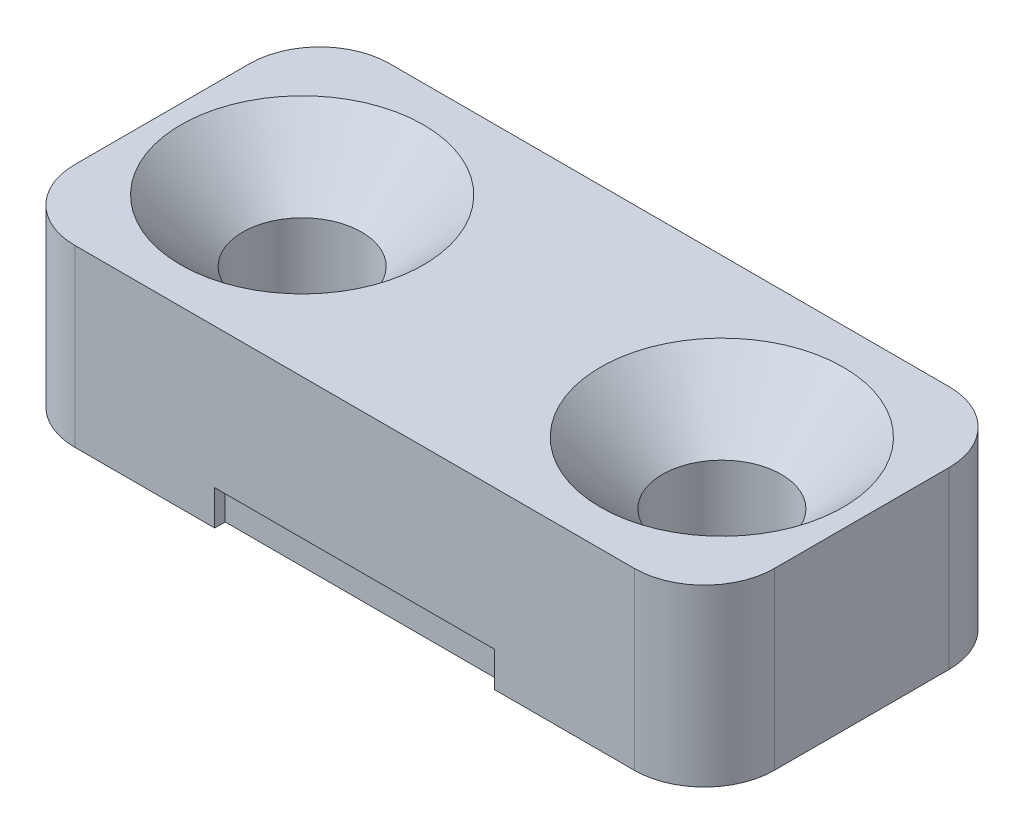
ISO-10303-21;
HEADER;
FILE_DESCRIPTION(('STEP AP214'),'2;1');
FILE_NAME('part.step','',(''),(''),'','','');
FILE_SCHEMA(('AUTOMOTIVE_DESIGN { 1 0 10303 214 1 1 1 1 }'));
ENDSEC;
DATA;
#1=APPLICATION_CONTEXT('core data for automotive mechanical design processes');
#2=APPLICATION_PROTOCOL_DEFINITION('international standard','automotive_design',2000,#1);
#3=PRODUCT_CONTEXT('',#1,'mechanical');
#4=PRODUCT('Part','Part','',(#3));
#5=PRODUCT_RELATED_PRODUCT_CATEGORY('part','',(#4));
#6=PRODUCT_DEFINITION_FORMATION('','',#4);
#7=PRODUCT_DEFINITION_CONTEXT('part definition',#1,'design');
#8=PRODUCT_DEFINITION('design','',#6,#7);
#9=PRODUCT_DEFINITION_SHAPE('','',#8);
#10=(LENGTH_UNIT() NAMED_UNIT(*) SI_UNIT(.MILLI.,.METRE.));
#11=(NAMED_UNIT(*) PLANE_ANGLE_UNIT() SI_UNIT($,.RADIAN.));
#12=(NAMED_UNIT(*) SI_UNIT($,.STERADIAN.) SOLID_ANGLE_UNIT());
#13=UNCERTAINTY_MEASURE_WITH_UNIT(LENGTH_MEASURE(1.E-05),#10,'distance_accuracy_value','');
#14=(GEOMETRIC_REPRESENTATION_CONTEXT(3) GLOBAL_UNCERTAINTY_ASSIGNED_CONTEXT((#13)) GLOBAL_UNIT_ASSIGNED_CONTEXT((#10,
#11,#12)) REPRESENTATION_CONTEXT('',''));
#15=CARTESIAN_POINT('',(0.,0.,0.));
#16=DIRECTION('',(0.,0.,1.));
#17=DIRECTION('',(1.,0.,0.));
#18=AXIS2_PLACEMENT_3D('',#15,#16,#17);
#19=CARTESIAN_POINT('',(8.,0.,-2.5));
#20=DIRECTION('',(0.,-1.,0.));
#21=DIRECTION('',(0.,0.,-1.));
#22=AXIS2_PLACEMENT_3D('',#19,#20,#21);
#23=PLANE('',#22);
#24=DIRECTION('',(1.,0.,0.));
#25=VECTOR('',#24,1.);
#26=CARTESIAN_POINT('',(-4.,0.,-0.8));
#27=LINE('',#26,#25);
#28=CARTESIAN_POINT('',(-4.,0.,-0.8));
#29=VERTEX_POINT('',#28);
#30=CARTESIAN_POINT('',(4.,0.,-0.800000000000001));
#31=VERTEX_POINT('',#30);
#32=EDGE_CURVE('E279',#29,#31,#27,.T.);
#33=ORIENTED_EDGE('',*,*,#32,.F.);
#34=DIRECTION('',(0.,0.,-1.));
#35=VECTOR('',#34,1.);
#36=CARTESIAN_POINT('',(-4.,0.,0.8));
#37=LINE('',#36,#35);
#38=CARTESIAN_POINT('',(-4.,0.,0.8));
#39=VERTEX_POINT('',#38);
#40=EDGE_CURVE('E255',#39,#29,#37,.T.);
#41=ORIENTED_EDGE('',*,*,#40,.F.);
#42=DIRECTION('',(1.,0.,0.));
#43=VECTOR('',#42,1.);
#44=CARTESIAN_POINT('',(-4.,0.,0.8));
#45=LINE('',#44,#43);
#46=CARTESIAN_POINT('',(4.,0.,0.8));
#47=VERTEX_POINT('',#46);
#48=EDGE_CURVE('E265',#39,#47,#45,.T.);
#49=ORIENTED_EDGE('',*,*,#48,.T.);
#50=DIRECTION('',(0.,0.,-1.));
#51=VECTOR('',#50,1.);
#52=CARTESIAN_POINT('',(4.,0.,0.8));
#53=LINE('',#52,#51);
#54=EDGE_CURVE('E268',#47,#31,#53,.T.);
#55=ORIENTED_EDGE('',*,*,#54,.T.);
#56=EDGE_LOOP('',(#33,#41,#49,#55));
#57=FACE_BOUND('',#56,.T.);
#58=DIRECTION('',(1.,0.,0.));
#59=VECTOR('',#58,1.);
#60=CARTESIAN_POINT('',(-4.,0.,-3.3));
#61=LINE('',#60,#59);
#62=CARTESIAN_POINT('',(-4.,0.,-3.3));
#63=VERTEX_POINT('',#62);
#64=CARTESIAN_POINT('',(4.,0.,-3.3));
#65=VERTEX_POINT('',#64);
#66=EDGE_CURVE('E346',#63,#65,#61,.T.);
#67=ORIENTED_EDGE('',*,*,#66,.F.);
#68=DIRECTION('',(0.,0.,-1.));
#69=VECTOR('',#68,1.);
#70=CARTESIAN_POINT('',(-4.,0.,-1.7));
#71=LINE('',#70,#69);
#72=CARTESIAN_POINT('',(-4.,0.,-1.7));
#73=VERTEX_POINT('',#72);
#74=EDGE_CURVE('E320',#73,#63,#71,.T.);
#75=ORIENTED_EDGE('',*,*,#74,.F.);
#76=DIRECTION('',(1.,0.,0.));
#77=VECTOR('',#76,1.);
#78=CARTESIAN_POINT('',(-4.,0.,-1.7));
#79=LINE('',#78,#77);
#80=CARTESIAN_POINT('',(4.,0.,-1.7));
#81=VERTEX_POINT('',#80);
#82=EDGE_CURVE('E330',#73,#81,#79,.T.);
#83=ORIENTED_EDGE('',*,*,#82,.T.);
#84=DIRECTION('',(0.,0.,-1.));
#85=VECTOR('',#84,1.);
#86=CARTESIAN_POINT('',(4.,0.,-1.7));
#87=LINE('',#86,#85);
#88=EDGE_CURVE('E333',#81,#65,#87,.T.);
#89=ORIENTED_EDGE('',*,*,#88,.T.);
#90=EDGE_LOOP('',(#67,#75,#83,#89));
#91=FACE_BOUND('',#90,.T.);
#92=CARTESIAN_POINT('',(6.,0.,0.));
#93=DIRECTION('',(0.,1.,0.));
#94=DIRECTION('',(0.,0.,1.));
#95=AXIS2_PLACEMENT_3D('',#92,#93,#94);
#96=CIRCLE('',#95,1.7);
#97=CARTESIAN_POINT('',(6.,0.,1.7));
#98=VERTEX_POINT('',#97);
#99=EDGE_CURVE('E387',#98,#98,#96,.T.);
#100=ORIENTED_EDGE('',*,*,#99,.T.);
#101=EDGE_LOOP('',(#100));
#102=FACE_BOUND('',#101,.T.);
#103=CARTESIAN_POINT('',(-6.,0.,0.));
#104=DIRECTION('',(0.,1.,0.));
#105=DIRECTION('',(0.,0.,1.));
#106=AXIS2_PLACEMENT_3D('',#103,#104,#105);
#107=CIRCLE('',#106,1.7);
#108=CARTESIAN_POINT('',(-6.,0.,1.7));
#109=VERTEX_POINT('',#108);
#110=EDGE_CURVE('E378',#109,#109,#107,.T.);
#111=ORIENTED_EDGE('',*,*,#110,.T.);
#112=EDGE_LOOP('',(#111));
#113=FACE_BOUND('',#112,.T.);
#114=DIRECTION('',(1.,0.,0.));
#115=VECTOR('',#114,1.);
#116=CARTESIAN_POINT('',(-4.,0.,1.7));
#117=LINE('',#116,#115);
#118=CARTESIAN_POINT('',(-4.,0.,1.7));
#119=VERTEX_POINT('',#118);
#120=CARTESIAN_POINT('',(4.,0.,1.7));
#121=VERTEX_POINT('',#120);
#122=EDGE_CURVE('E312',#119,#121,#117,.T.);
#123=ORIENTED_EDGE('',*,*,#122,.F.);
#124=DIRECTION('',(0.,0.,-1.));
#125=VECTOR('',#124,1.);
#126=CARTESIAN_POINT('',(-4.,0.,3.3));
#127=LINE('',#126,#125);
#128=CARTESIAN_POINT('',(-4.,0.,3.3));
#129=VERTEX_POINT('',#128);
#130=EDGE_CURVE('E286',#129,#119,#127,.T.);
#131=ORIENTED_EDGE('',*,*,#130,.F.);
#132=DIRECTION('',(1.,0.,0.));
#133=VECTOR('',#132,1.);
#134=CARTESIAN_POINT('',(-4.,0.,3.3));
#135=LINE('',#134,#133);
#136=CARTESIAN_POINT('',(4.,0.,3.3));
#137=VERTEX_POINT('',#136);
#138=EDGE_CURVE('E296',#129,#137,#135,.T.);
#139=ORIENTED_EDGE('',*,*,#138,.T.);
#140=DIRECTION('',(0.,0.,-1.));
#141=VECTOR('',#140,1.);
#142=CARTESIAN_POINT('',(4.,0.,3.3));
#143=LINE('',#142,#141);
#144=EDGE_CURVE('E299',#137,#121,#143,.T.);
#145=ORIENTED_EDGE('',*,*,#144,.T.);
#146=EDGE_LOOP('',(#123,#131,#139,#145));
#147=FACE_BOUND('',#146,.T.);
#148=DIRECTION('',(-1.,0.,0.));
#149=VECTOR('',#148,1.);
#150=CARTESIAN_POINT('',(-8.,0.,-4.5));
#151=LINE('',#150,#149);
#152=CARTESIAN_POINT('',(-4.,0.,-4.5));
#153=VERTEX_POINT('',#152);
#154=CARTESIAN_POINT('',(-8.,0.,-4.5));
#155=VERTEX_POINT('',#154);
#156=EDGE_CURVE('E242',#153,#155,#151,.T.);
#157=ORIENTED_EDGE('',*,*,#156,.F.);
#158=DIRECTION('',(0.,0.,-1.));
#159=VECTOR('',#158,1.);
#160=CARTESIAN_POINT('',(-4.,0.,-4.2));
#161=LINE('',#160,#159);
#162=CARTESIAN_POINT('',(-4.,0.,-4.2));
#163=VERTEX_POINT('',#162);
#164=EDGE_CURVE('E235',#163,#153,#161,.T.);
#165=ORIENTED_EDGE('',*,*,#164,.F.);
#166=DIRECTION('',(1.,0.,0.));
#167=VECTOR('',#166,1.);
#168=CARTESIAN_POINT('',(-4.,0.,-4.2));
#169=LINE('',#168,#167);
#170=CARTESIAN_POINT('',(4.,0.,-4.2));
#171=VERTEX_POINT('',#170);
#172=EDGE_CURVE('E221',#163,#171,#169,.T.);
#173=ORIENTED_EDGE('',*,*,#172,.T.);
#174=DIRECTION('',(0.,0.,-1.));
#175=VECTOR('',#174,1.);
#176=CARTESIAN_POINT('',(4.,0.,-4.2));
#177=LINE('',#176,#175);
#178=CARTESIAN_POINT('',(4.,0.,-4.5));
#179=VERTEX_POINT('',#178);
#180=EDGE_CURVE('E247',#171,#179,#177,.T.);
#181=ORIENTED_EDGE('',*,*,#180,.T.);
#182=CARTESIAN_POINT('',(8.,0.,-4.5));
#183=VERTEX_POINT('',#182);
#184=EDGE_CURVE('E412',#183,#179,#151,.T.);
#185=ORIENTED_EDGE('',*,*,#184,.F.);
#186=CARTESIAN_POINT('',(8.,0.,-2.5));
#187=DIRECTION('',(0.,1.,0.));
#188=DIRECTION('',(0.,0.,-1.));
#189=AXIS2_PLACEMENT_3D('',#186,#187,#188);
#190=CIRCLE('',#189,2.);
#191=CARTESIAN_POINT('',(10.,0.,-2.5));
#192=VERTEX_POINT('',#191);
#193=EDGE_CURVE('E390',#192,#183,#190,.T.);
#194=ORIENTED_EDGE('',*,*,#193,.F.);
#195=DIRECTION('',(0.,0.,-1.));
#196=VECTOR('',#195,1.);
#197=CARTESIAN_POINT('',(10.,0.,-2.5));
#198=LINE('',#197,#196);
#199=CARTESIAN_POINT('',(10.,0.,2.5));
#200=VERTEX_POINT('',#199);
#201=EDGE_CURVE('E395',#200,#192,#198,.T.);
#202=ORIENTED_EDGE('',*,*,#201,.F.);
#203=CARTESIAN_POINT('',(8.,0.,2.5));
#204=DIRECTION('',(0.,1.,0.));
#205=DIRECTION('',(0.,0.,1.));
#206=AXIS2_PLACEMENT_3D('',#203,#204,#205);
#207=CIRCLE('',#206,2.);
#208=CARTESIAN_POINT('',(8.,0.,4.5));
#209=VERTEX_POINT('',#208);
#210=EDGE_CURVE('E425',#209,#200,#207,.T.);
#211=ORIENTED_EDGE('',*,*,#210,.F.);
#212=DIRECTION('',(1.,0.,0.));
#213=VECTOR('',#212,1.);
#214=CARTESIAN_POINT('',(-8.,0.,4.5));
#215=LINE('',#214,#213);
#216=CARTESIAN_POINT('',(4.,0.,4.5));
#217=VERTEX_POINT('',#216);
#218=EDGE_CURVE('E421',#217,#209,#215,.T.);
#219=ORIENTED_EDGE('',*,*,#218,.F.);
#220=DIRECTION('',(0.,0.,1.));
#221=VECTOR('',#220,1.);
#222=CARTESIAN_POINT('',(4.,0.,-2.5));
#223=LINE('',#222,#221);
#224=CARTESIAN_POINT('',(4.,0.,4.2));
#225=VERTEX_POINT('',#224);
#226=EDGE_CURVE('E451',#225,#217,#223,.T.);
#227=ORIENTED_EDGE('',*,*,#226,.F.);
#228=DIRECTION('',(1.,0.,0.));
#229=VECTOR('',#228,1.);
#230=CARTESIAN_POINT('',(-4.,0.,4.2));
#231=LINE('',#230,#229);
#232=CARTESIAN_POINT('',(-4.,0.,4.2));
#233=VERTEX_POINT('',#232);
#234=EDGE_CURVE('E358',#233,#225,#231,.T.);
#235=ORIENTED_EDGE('',*,*,#234,.F.);
#236=DIRECTION('',(0.,0.,1.));
#237=VECTOR('',#236,1.);
#238=CARTESIAN_POINT('',(-4.,0.,-2.5));
#239=LINE('',#238,#237);
#240=CARTESIAN_POINT('',(-4.,0.,4.5));
#241=VERTEX_POINT('',#240);
#242=EDGE_CURVE('E453',#233,#241,#239,.T.);
#243=ORIENTED_EDGE('',*,*,#242,.T.);
#244=CARTESIAN_POINT('',(-8.,0.,4.5));
#245=VERTEX_POINT('',#244);
#246=EDGE_CURVE('E422',#245,#241,#215,.T.);
#247=ORIENTED_EDGE('',*,*,#246,.F.);
#248=CARTESIAN_POINT('',(-8.,0.,2.5));
#249=DIRECTION('',(0.,1.,0.));
#250=DIRECTION('',(0.,0.,1.));
#251=AXIS2_PLACEMENT_3D('',#248,#249,#250);
#252=CIRCLE('',#251,2.);
#253=CARTESIAN_POINT('',(-10.,0.,2.5));
#254=VERTEX_POINT('',#253);
#255=EDGE_CURVE('E419',#254,#245,#252,.T.);
#256=ORIENTED_EDGE('',*,*,#255,.F.);
#257=DIRECTION('',(0.,0.,1.));
#258=VECTOR('',#257,1.);
#259=CARTESIAN_POINT('',(-10.,0.,-2.5));
#260=LINE('',#259,#258);
#261=CARTESIAN_POINT('',(-10.,0.,-2.5));
#262=VERTEX_POINT('',#261);
#263=EDGE_CURVE('E417',#262,#254,#260,.T.);
#264=ORIENTED_EDGE('',*,*,#263,.F.);
#265=CARTESIAN_POINT('',(-8.,0.,-2.5));
#266=DIRECTION('',(0.,1.,0.));
#267=DIRECTION('',(0.,0.,1.));
#268=AXIS2_PLACEMENT_3D('',#265,#266,#267);
#269=CIRCLE('',#268,2.);
#270=EDGE_CURVE('E415',#155,#262,#269,.T.);
#271=ORIENTED_EDGE('',*,*,#270,.F.);
#272=EDGE_LOOP('',(#157,#165,#173,#181,#185,#194,#202,#211,#219,#227,#235,#243,#247,#256,#264,#271));
#273=FACE_BOUND('',#272,.T.);
#274=ADVANCED_FACE('F35',(#57,#91,#102,#113,#147,#273),#23,.T.);
#275=CARTESIAN_POINT('',(-8.,5.,-4.5));
#276=DIRECTION('',(0.,0.,1.));
#277=DIRECTION('',(1.,0.,0.));
#278=AXIS2_PLACEMENT_3D('',#275,#276,#277);
#279=PLANE('',#278);
#280=DIRECTION('',(0.,1.,0.));
#281=VECTOR('',#280,1.);
#282=CARTESIAN_POINT('',(-4.,5.,-4.5));
#283=LINE('',#282,#281);
#284=CARTESIAN_POINT('',(-4.,1.,-4.5));
#285=VERTEX_POINT('',#284);
#286=EDGE_CURVE('E11',#153,#285,#283,.T.);
#287=ORIENTED_EDGE('',*,*,#286,.F.);
#288=ORIENTED_EDGE('',*,*,#156,.T.);
#289=DIRECTION('',(0.,-1.,0.));
#290=VECTOR('',#289,1.);
#291=CARTESIAN_POINT('',(-8.,5.,-4.5));
#292=LINE('',#291,#290);
#293=CARTESIAN_POINT('',(-8.,5.,-4.5));
#294=VERTEX_POINT('',#293);
#295=EDGE_CURVE('E445',#294,#155,#292,.T.);
#296=ORIENTED_EDGE('',*,*,#295,.F.);
#297=DIRECTION('',(-1.,0.,0.));
#298=VECTOR('',#297,1.);
#299=CARTESIAN_POINT('',(-8.,5.,-4.5));
#300=LINE('',#299,#298);
#301=CARTESIAN_POINT('',(8.,5.,-4.5));
#302=VERTEX_POINT('',#301);
#303=EDGE_CURVE('E394',#302,#294,#300,.T.);
#304=ORIENTED_EDGE('',*,*,#303,.F.);
#305=DIRECTION('',(0.,-1.,0.));
#306=VECTOR('',#305,1.);
#307=CARTESIAN_POINT('',(8.,5.,-4.5));
#308=LINE('',#307,#306);
#309=EDGE_CURVE('E448',#302,#183,#308,.T.);
#310=ORIENTED_EDGE('',*,*,#309,.T.);
#311=ORIENTED_EDGE('',*,*,#184,.T.);
#312=DIRECTION('',(0.,1.,0.));
#313=VECTOR('',#312,1.);
#314=CARTESIAN_POINT('',(4.,5.,-4.5));
#315=LINE('',#314,#313);
#316=CARTESIAN_POINT('',(4.,1.,-4.5));
#317=VERTEX_POINT('',#316);
#318=EDGE_CURVE('E459',#179,#317,#315,.T.);
#319=ORIENTED_EDGE('',*,*,#318,.T.);
#320=DIRECTION('',(-1.,0.,0.));
#321=VECTOR('',#320,1.);
#322=CARTESIAN_POINT('',(-8.,1.,-4.5));
#323=LINE('',#322,#321);
#324=EDGE_CURVE('E43',#317,#285,#323,.T.);
#325=ORIENTED_EDGE('',*,*,#324,.T.);
#326=EDGE_LOOP('',(#287,#288,#296,#304,#310,#311,#319,#325));
#327=FACE_BOUND('',#326,.T.);
#328=ADVANCED_FACE('F463',(#327),#279,.F.);
#329=CARTESIAN_POINT('',(-8.,5.,4.5));
#330=DIRECTION('',(0.,0.,-1.));
#331=DIRECTION('',(-1.,0.,0.));
#332=AXIS2_PLACEMENT_3D('',#329,#330,#331);
#333=PLANE('',#332);
#334=DIRECTION('',(0.,-1.,0.));
#335=VECTOR('',#334,1.);
#336=CARTESIAN_POINT('',(-4.,5.,4.5));
#337=LINE('',#336,#335);
#338=CARTESIAN_POINT('',(-4.,1.,4.5));
#339=VERTEX_POINT('',#338);
#340=EDGE_CURVE('E370',#339,#241,#337,.T.);
#341=ORIENTED_EDGE('',*,*,#340,.F.);
#342=DIRECTION('',(1.,0.,0.));
#343=VECTOR('',#342,1.);
#344=CARTESIAN_POINT('',(-8.,1.,4.5));
#345=LINE('',#344,#343);
#346=CARTESIAN_POINT('',(4.,1.,4.5));
#347=VERTEX_POINT('',#346);
#348=EDGE_CURVE('E456',#339,#347,#345,.T.);
#349=ORIENTED_EDGE('',*,*,#348,.T.);
#350=DIRECTION('',(0.,-1.,0.));
#351=VECTOR('',#350,1.);
#352=CARTESIAN_POINT('',(4.,5.,4.5));
#353=LINE('',#352,#351);
#354=EDGE_CURVE('E365',#347,#217,#353,.T.);
#355=ORIENTED_EDGE('',*,*,#354,.T.);
#356=ORIENTED_EDGE('',*,*,#218,.T.);
#357=DIRECTION('',(0.,-1.,0.));
#358=VECTOR('',#357,1.);
#359=CARTESIAN_POINT('',(8.,5.,4.5));
#360=LINE('',#359,#358);
#361=CARTESIAN_POINT('',(8.,5.,4.5));
#362=VERTEX_POINT('',#361);
#363=EDGE_CURVE('E433',#362,#209,#360,.T.);
#364=ORIENTED_EDGE('',*,*,#363,.F.);
#365=DIRECTION('',(1.,0.,0.));
#366=VECTOR('',#365,1.);
#367=CARTESIAN_POINT('',(-8.,5.,4.5));
#368=LINE('',#367,#366);
#369=CARTESIAN_POINT('',(-8.,5.,4.5));
#370=VERTEX_POINT('',#369);
#371=EDGE_CURVE('E403',#370,#362,#368,.T.);
#372=ORIENTED_EDGE('',*,*,#371,.F.);
#373=DIRECTION('',(0.,-1.,0.));
#374=VECTOR('',#373,1.);
#375=CARTESIAN_POINT('',(-8.,5.,4.5));
#376=LINE('',#375,#374);
#377=EDGE_CURVE('E436',#370,#245,#376,.T.);
#378=ORIENTED_EDGE('',*,*,#377,.T.);
#379=ORIENTED_EDGE('',*,*,#246,.T.);
#380=EDGE_LOOP('',(#341,#349,#355,#356,#364,#372,#378,#379));
#381=FACE_BOUND('',#380,.T.);
#382=ADVANCED_FACE('F487',(#381),#333,.F.);
#383=CARTESIAN_POINT('',(8.,5.,-2.5));
#384=DIRECTION('',(0.,-1.,0.));
#385=DIRECTION('',(0.,0.,-1.));
#386=AXIS2_PLACEMENT_3D('',#383,#384,#385);
#387=CYLINDRICAL_SURFACE('',#386,2.);
#388=ORIENTED_EDGE('',*,*,#193,.T.);
#389=ORIENTED_EDGE('',*,*,#309,.F.);
#390=CARTESIAN_POINT('',(8.,5.,-2.5));
#391=DIRECTION('',(0.,1.,0.));
#392=DIRECTION('',(0.,0.,-1.));
#393=AXIS2_PLACEMENT_3D('',#390,#391,#392);
#394=CIRCLE('',#393,2.);
#395=CARTESIAN_POINT('',(10.,5.,-2.5));
#396=VERTEX_POINT('',#395);
#397=EDGE_CURVE('E391',#396,#302,#394,.T.);
#398=ORIENTED_EDGE('',*,*,#397,.F.);
#399=DIRECTION('',(0.,-1.,0.));
#400=VECTOR('',#399,1.);
#401=CARTESIAN_POINT('',(10.,5.,-2.5));
#402=LINE('',#401,#400);
#403=EDGE_CURVE('E409',#396,#192,#402,.T.);
#404=ORIENTED_EDGE('',*,*,#403,.T.);
#405=EDGE_LOOP('',(#388,#389,#398,#404));
#406=FACE_BOUND('',#405,.T.);
#407=ADVANCED_FACE('F37',(#406),#387,.T.);
#408=CARTESIAN_POINT('',(-8.,5.,-2.5));
#409=DIRECTION('',(0.,-1.,0.));
#410=DIRECTION('',(0.,0.,-1.));
#411=AXIS2_PLACEMENT_3D('',#408,#409,#410);
#412=CYLINDRICAL_SURFACE('',#411,2.);
#413=ORIENTED_EDGE('',*,*,#270,.T.);
#414=DIRECTION('',(0.,-1.,0.));
#415=VECTOR('',#414,1.);
#416=CARTESIAN_POINT('',(-10.,5.,-2.5));
#417=LINE('',#416,#415);
#418=CARTESIAN_POINT('',(-10.,5.,-2.5));
#419=VERTEX_POINT('',#418);
#420=EDGE_CURVE('E442',#419,#262,#417,.T.);
#421=ORIENTED_EDGE('',*,*,#420,.F.);
#422=CARTESIAN_POINT('',(-8.,5.,-2.5));
#423=DIRECTION('',(0.,1.,0.));
#424=DIRECTION('',(0.,0.,1.));
#425=AXIS2_PLACEMENT_3D('',#422,#423,#424);
#426=CIRCLE('',#425,2.);
#427=EDGE_CURVE('E397',#294,#419,#426,.T.);
#428=ORIENTED_EDGE('',*,*,#427,.F.);
#429=ORIENTED_EDGE('',*,*,#295,.T.);
#430=EDGE_LOOP('',(#413,#421,#428,#429));
#431=FACE_BOUND('',#430,.T.);
#432=ADVANCED_FACE('F515',(#431),#412,.T.);
#433=CARTESIAN_POINT('',(-10.,5.,-2.5));
#434=DIRECTION('',(1.,0.,0.));
#435=DIRECTION('',(0.,0.,-1.));
#436=AXIS2_PLACEMENT_3D('',#433,#434,#435);
#437=PLANE('',#436);
#438=ORIENTED_EDGE('',*,*,#263,.T.);
#439=DIRECTION('',(0.,-1.,0.));
#440=VECTOR('',#439,1.);
#441=CARTESIAN_POINT('',(-10.,5.,2.5));
#442=LINE('',#441,#440);
#443=CARTESIAN_POINT('',(-10.,5.,2.5));
#444=VERTEX_POINT('',#443);
#445=EDGE_CURVE('E439',#444,#254,#442,.T.);
#446=ORIENTED_EDGE('',*,*,#445,.F.);
#447=DIRECTION('',(0.,0.,1.));
#448=VECTOR('',#447,1.);
#449=CARTESIAN_POINT('',(-10.,5.,-2.5));
#450=LINE('',#449,#448);
#451=EDGE_CURVE('E399',#419,#444,#450,.T.);
#452=ORIENTED_EDGE('',*,*,#451,.F.);
#453=ORIENTED_EDGE('',*,*,#420,.T.);
#454=EDGE_LOOP('',(#438,#446,#452,#453));
#455=FACE_BOUND('',#454,.T.);
#456=ADVANCED_FACE('F511',(#455),#437,.F.);
#457=CARTESIAN_POINT('',(-8.,5.,2.5));
#458=DIRECTION('',(0.,-1.,0.));
#459=DIRECTION('',(0.,0.,-1.));
#460=AXIS2_PLACEMENT_3D('',#457,#458,#459);
#461=CYLINDRICAL_SURFACE('',#460,2.);
#462=ORIENTED_EDGE('',*,*,#255,.T.);
#463=ORIENTED_EDGE('',*,*,#377,.F.);
#464=CARTESIAN_POINT('',(-8.,5.,2.5));
#465=DIRECTION('',(0.,1.,0.));
#466=DIRECTION('',(0.,0.,1.));
#467=AXIS2_PLACEMENT_3D('',#464,#465,#466);
#468=CIRCLE('',#467,2.);
#469=EDGE_CURVE('E401',#444,#370,#468,.T.);
#470=ORIENTED_EDGE('',*,*,#469,.F.);
#471=ORIENTED_EDGE('',*,*,#445,.T.);
#472=EDGE_LOOP('',(#462,#463,#470,#471));
#473=FACE_BOUND('',#472,.T.);
#474=ADVANCED_FACE('F506',(#473),#461,.T.);
#475=CARTESIAN_POINT('',(8.,5.,2.5));
#476=DIRECTION('',(0.,-1.,0.));
#477=DIRECTION('',(0.,0.,-1.));
#478=AXIS2_PLACEMENT_3D('',#475,#476,#477);
#479=CYLINDRICAL_SURFACE('',#478,2.);
#480=ORIENTED_EDGE('',*,*,#210,.T.);
#481=DIRECTION('',(0.,-1.,0.));
#482=VECTOR('',#481,1.);
#483=CARTESIAN_POINT('',(10.,5.,2.5));
#484=LINE('',#483,#482);
#485=CARTESIAN_POINT('',(10.,5.,2.5));
#486=VERTEX_POINT('',#485);
#487=EDGE_CURVE('E430',#486,#200,#484,.T.);
#488=ORIENTED_EDGE('',*,*,#487,.F.);
#489=CARTESIAN_POINT('',(8.,5.,2.5));
#490=DIRECTION('',(0.,1.,0.));
#491=DIRECTION('',(0.,0.,1.));
#492=AXIS2_PLACEMENT_3D('',#489,#490,#491);
#493=CIRCLE('',#492,2.);
#494=EDGE_CURVE('E405',#362,#486,#493,.T.);
#495=ORIENTED_EDGE('',*,*,#494,.F.);
#496=ORIENTED_EDGE('',*,*,#363,.T.);
#497=EDGE_LOOP('',(#480,#488,#495,#496));
#498=FACE_BOUND('',#497,.T.);
#499=ADVANCED_FACE('F482',(#498),#479,.T.);
#500=CARTESIAN_POINT('',(10.,5.,-2.5));
#501=DIRECTION('',(-1.,0.,0.));
#502=DIRECTION('',(0.,0.,1.));
#503=AXIS2_PLACEMENT_3D('',#500,#501,#502);
#504=PLANE('',#503);
#505=ORIENTED_EDGE('',*,*,#201,.T.);
#506=ORIENTED_EDGE('',*,*,#403,.F.);
#507=DIRECTION('',(0.,0.,-1.));
#508=VECTOR('',#507,1.);
#509=CARTESIAN_POINT('',(10.,5.,-2.5));
#510=LINE('',#509,#508);
#511=EDGE_CURVE('E407',#486,#396,#510,.T.);
#512=ORIENTED_EDGE('',*,*,#511,.F.);
#513=ORIENTED_EDGE('',*,*,#487,.T.);
#514=EDGE_LOOP('',(#505,#506,#512,#513));
#515=FACE_BOUND('',#514,.T.);
#516=ADVANCED_FACE('F477',(#515),#504,.F.);
#517=CARTESIAN_POINT('',(8.,5.,-2.5));
#518=DIRECTION('',(0.,-1.,0.));
#519=DIRECTION('',(0.,0.,-1.));
#520=AXIS2_PLACEMENT_3D('',#517,#518,#519);
#521=PLANE('',#520);
#522=CARTESIAN_POINT('',(-6.,5.,0.));
#523=DIRECTION('',(0.,1.,0.));
#524=DIRECTION('',(0.,0.,1.));
#525=AXIS2_PLACEMENT_3D('',#522,#523,#524);
#526=CIRCLE('',#525,3.47);
#527=CARTESIAN_POINT('',(-6.,5.,3.47));
#528=VERTEX_POINT('',#527);
#529=EDGE_CURVE('E372',#528,#528,#526,.T.);
#530=ORIENTED_EDGE('',*,*,#529,.F.);
#531=EDGE_LOOP('',(#530));
#532=FACE_BOUND('',#531,.T.);
#533=CARTESIAN_POINT('',(6.,5.,0.));
#534=DIRECTION('',(0.,1.,0.));
#535=DIRECTION('',(0.,0.,1.));
#536=AXIS2_PLACEMENT_3D('',#533,#534,#535);
#537=CIRCLE('',#536,3.47);
#538=CARTESIAN_POINT('',(6.,5.,3.47));
#539=VERTEX_POINT('',#538);
#540=EDGE_CURVE('E381',#539,#539,#537,.T.);
#541=ORIENTED_EDGE('',*,*,#540,.F.);
#542=EDGE_LOOP('',(#541));
#543=FACE_BOUND('',#542,.T.);
#544=ORIENTED_EDGE('',*,*,#397,.T.);
#545=ORIENTED_EDGE('',*,*,#303,.T.);
#546=ORIENTED_EDGE('',*,*,#427,.T.);
#547=ORIENTED_EDGE('',*,*,#451,.T.);
#548=ORIENTED_EDGE('',*,*,#469,.T.);
#549=ORIENTED_EDGE('',*,*,#371,.T.);
#550=ORIENTED_EDGE('',*,*,#494,.T.);
#551=ORIENTED_EDGE('',*,*,#511,.T.);
#552=EDGE_LOOP('',(#544,#545,#546,#547,#548,#549,#550,#551));
#553=FACE_BOUND('',#552,.T.);
#554=ADVANCED_FACE('F517',(#532,#543,#553),#521,.F.);
#555=CARTESIAN_POINT('',(6.,5.,0.));
#556=DIRECTION('',(0.,1.,0.));
#557=DIRECTION('',(0.,0.,1.));
#558=AXIS2_PLACEMENT_3D('',#555,#556,#557);
#559=CYLINDRICAL_SURFACE('',#558,1.7);
#560=ORIENTED_EDGE('',*,*,#99,.F.);
#561=EDGE_LOOP('',(#560));
#562=FACE_BOUND('',#561,.T.);
#563=CARTESIAN_POINT('',(6.,3.23,0.));
#564=DIRECTION('',(0.,1.,0.));
#565=DIRECTION('',(0.,0.,1.));
#566=AXIS2_PLACEMENT_3D('',#563,#564,#565);
#567=CIRCLE('',#566,1.7);
#568=CARTESIAN_POINT('',(6.,3.23,1.7));
#569=VERTEX_POINT('',#568);
#570=EDGE_CURVE('E384',#569,#569,#567,.T.);
#571=ORIENTED_EDGE('',*,*,#570,.T.);
#572=EDGE_LOOP('',(#571));
#573=FACE_BOUND('',#572,.T.);
#574=ADVANCED_FACE('F519',(#562,#573),#559,.F.);
#575=CARTESIAN_POINT('',(6.,5.,0.));
#576=DIRECTION('',(0.,1.,0.));
#577=DIRECTION('',(0.,0.,1.));
#578=AXIS2_PLACEMENT_3D('',#575,#576,#577);
#579=CONICAL_SURFACE('',#578,3.47,0.785398163397449);
#580=ORIENTED_EDGE('',*,*,#570,.F.);
#581=EDGE_LOOP('',(#580));
#582=FACE_BOUND('',#581,.T.);
#583=ORIENTED_EDGE('',*,*,#540,.T.);
#584=EDGE_LOOP('',(#583));
#585=FACE_BOUND('',#584,.T.);
#586=ADVANCED_FACE('F526',(#582,#585),#579,.F.);
#587=CARTESIAN_POINT('',(-6.,5.,0.));
#588=DIRECTION('',(0.,1.,0.));
#589=DIRECTION('',(0.,0.,1.));
#590=AXIS2_PLACEMENT_3D('',#587,#588,#589);
#591=CYLINDRICAL_SURFACE('',#590,1.7);
#592=ORIENTED_EDGE('',*,*,#110,.F.);
#593=EDGE_LOOP('',(#592));
#594=FACE_BOUND('',#593,.T.);
#595=CARTESIAN_POINT('',(-6.,3.23,0.));
#596=DIRECTION('',(0.,1.,0.));
#597=DIRECTION('',(0.,0.,1.));
#598=AXIS2_PLACEMENT_3D('',#595,#596,#597);
#599=CIRCLE('',#598,1.7);
#600=CARTESIAN_POINT('',(-6.,3.23,1.7));
#601=VERTEX_POINT('',#600);
#602=EDGE_CURVE('E375',#601,#601,#599,.T.);
#603=ORIENTED_EDGE('',*,*,#602,.T.);
#604=EDGE_LOOP('',(#603));
#605=FACE_BOUND('',#604,.T.);
#606=ADVANCED_FACE('F579',(#594,#605),#591,.F.);
#607=CARTESIAN_POINT('',(-6.,5.,0.));
#608=DIRECTION('',(0.,1.,0.));
#609=DIRECTION('',(0.,0.,1.));
#610=AXIS2_PLACEMENT_3D('',#607,#608,#609);
#611=CONICAL_SURFACE('',#610,3.47,0.785398163397448);
#612=ORIENTED_EDGE('',*,*,#602,.F.);
#613=EDGE_LOOP('',(#612));
#614=FACE_BOUND('',#613,.T.);
#615=ORIENTED_EDGE('',*,*,#529,.T.);
#616=EDGE_LOOP('',(#615));
#617=FACE_BOUND('',#616,.T.);
#618=ADVANCED_FACE('F574',(#614,#617),#611,.F.);
#619=CARTESIAN_POINT('',(-4.,1.,5.8));
#620=DIRECTION('',(0.,1.,0.));
#621=DIRECTION('',(0.,0.,1.));
#622=AXIS2_PLACEMENT_3D('',#619,#620,#621);
#623=PLANE('',#622);
#624=DIRECTION('',(0.,0.,1.));
#625=VECTOR('',#624,1.);
#626=CARTESIAN_POINT('',(-4.,1.,5.8));
#627=LINE('',#626,#625);
#628=CARTESIAN_POINT('',(-4.,1.,4.2));
#629=VERTEX_POINT('',#628);
#630=EDGE_CURVE('E354',#629,#339,#627,.T.);
#631=ORIENTED_EDGE('',*,*,#630,.F.);
#632=DIRECTION('',(1.,0.,0.));
#633=VECTOR('',#632,1.);
#634=CARTESIAN_POINT('',(-4.,1.,4.2));
#635=LINE('',#634,#633);
#636=CARTESIAN_POINT('',(4.,1.,4.2));
#637=VERTEX_POINT('',#636);
#638=EDGE_CURVE('E363',#629,#637,#635,.T.);
#639=ORIENTED_EDGE('',*,*,#638,.T.);
#640=DIRECTION('',(0.,0.,1.));
#641=VECTOR('',#640,1.);
#642=CARTESIAN_POINT('',(4.,1.,5.8));
#643=LINE('',#642,#641);
#644=EDGE_CURVE('E355',#637,#347,#643,.T.);
#645=ORIENTED_EDGE('',*,*,#644,.T.);
#646=ORIENTED_EDGE('',*,*,#348,.F.);
#647=EDGE_LOOP('',(#631,#639,#645,#646));
#648=FACE_BOUND('',#647,.T.);
#649=ADVANCED_FACE('F500',(#648),#623,.F.);
#650=CARTESIAN_POINT('',(-4.,0.,0.));
#651=DIRECTION('',(1.,0.,0.));
#652=DIRECTION('',(0.,0.,-1.));
#653=AXIS2_PLACEMENT_3D('',#650,#651,#652);
#654=PLANE('',#653);
#655=ORIENTED_EDGE('',*,*,#340,.T.);
#656=ORIENTED_EDGE('',*,*,#242,.F.);
#657=DIRECTION('',(0.,1.,0.));
#658=VECTOR('',#657,1.);
#659=CARTESIAN_POINT('',(-4.,1.,4.2));
#660=LINE('',#659,#658);
#661=EDGE_CURVE('E351',#233,#629,#660,.T.);
#662=ORIENTED_EDGE('',*,*,#661,.T.);
#663=ORIENTED_EDGE('',*,*,#630,.T.);
#664=EDGE_LOOP('',(#655,#656,#662,#663));
#665=FACE_BOUND('',#664,.T.);
#666=ADVANCED_FACE('F498',(#665),#654,.T.);
#667=CARTESIAN_POINT('',(4.,0.,0.));
#668=DIRECTION('',(1.,0.,0.));
#669=DIRECTION('',(0.,0.,-1.));
#670=AXIS2_PLACEMENT_3D('',#667,#668,#669);
#671=PLANE('',#670);
#672=ORIENTED_EDGE('',*,*,#644,.F.);
#673=DIRECTION('',(0.,1.,0.));
#674=VECTOR('',#673,1.);
#675=CARTESIAN_POINT('',(4.,1.,4.2));
#676=LINE('',#675,#674);
#677=EDGE_CURVE('E343',#225,#637,#676,.T.);
#678=ORIENTED_EDGE('',*,*,#677,.F.);
#679=ORIENTED_EDGE('',*,*,#226,.T.);
#680=ORIENTED_EDGE('',*,*,#354,.F.);
#681=EDGE_LOOP('',(#672,#678,#679,#680));
#682=FACE_BOUND('',#681,.T.);
#683=ADVANCED_FACE('F492',(#682),#671,.F.);
#684=CARTESIAN_POINT('',(-4.,1.,4.2));
#685=DIRECTION('',(0.,0.,-1.));
#686=DIRECTION('',(-1.,0.,0.));
#687=AXIS2_PLACEMENT_3D('',#684,#685,#686);
#688=PLANE('',#687);
#689=ORIENTED_EDGE('',*,*,#677,.T.);
#690=ORIENTED_EDGE('',*,*,#638,.F.);
#691=ORIENTED_EDGE('',*,*,#661,.F.);
#692=ORIENTED_EDGE('',*,*,#234,.T.);
#693=EDGE_LOOP('',(#689,#690,#691,#692));
#694=FACE_BOUND('',#693,.T.);
#695=ADVANCED_FACE('F495',(#694),#688,.F.);
#696=CARTESIAN_POINT('',(-4.,1.,-1.7));
#697=DIRECTION('',(0.,0.,1.));
#698=DIRECTION('',(1.,0.,0.));
#699=AXIS2_PLACEMENT_3D('',#696,#697,#698);
#700=PLANE('',#699);
#701=DIRECTION('',(0.,-1.,0.));
#702=VECTOR('',#701,1.);
#703=CARTESIAN_POINT('',(4.,1.,-1.7));
#704=LINE('',#703,#702);
#705=CARTESIAN_POINT('',(4.,1.,-1.7));
#706=VERTEX_POINT('',#705);
#707=EDGE_CURVE('E309',#706,#81,#704,.T.);
#708=ORIENTED_EDGE('',*,*,#707,.T.);
#709=ORIENTED_EDGE('',*,*,#82,.F.);
#710=DIRECTION('',(0.,-1.,0.));
#711=VECTOR('',#710,1.);
#712=CARTESIAN_POINT('',(-4.,1.,-1.7));
#713=LINE('',#712,#711);
#714=CARTESIAN_POINT('',(-4.,1.,-1.7));
#715=VERTEX_POINT('',#714);
#716=EDGE_CURVE('E317',#715,#73,#713,.T.);
#717=ORIENTED_EDGE('',*,*,#716,.F.);
#718=DIRECTION('',(1.,0.,0.));
#719=VECTOR('',#718,1.);
#720=CARTESIAN_POINT('',(-4.,1.,-1.7));
#721=LINE('',#720,#719);
#722=EDGE_CURVE('E341',#715,#706,#721,.T.);
#723=ORIENTED_EDGE('',*,*,#722,.T.);
#724=EDGE_LOOP('',(#708,#709,#717,#723));
#725=FACE_BOUND('',#724,.T.);
#726=ADVANCED_FACE('F648',(#725),#700,.F.);
#727=CARTESIAN_POINT('',(-4.,1.,-1.7));
#728=DIRECTION('',(0.,1.,0.));
#729=DIRECTION('',(0.,0.,1.));
#730=AXIS2_PLACEMENT_3D('',#727,#728,#729);
#731=PLANE('',#730);
#732=DIRECTION('',(0.,0.,1.));
#733=VECTOR('',#732,1.);
#734=CARTESIAN_POINT('',(4.,1.,-1.7));
#735=LINE('',#734,#733);
#736=CARTESIAN_POINT('',(4.,1.,-3.3));
#737=VERTEX_POINT('',#736);
#738=EDGE_CURVE('E321',#737,#706,#735,.T.);
#739=ORIENTED_EDGE('',*,*,#738,.T.);
#740=ORIENTED_EDGE('',*,*,#722,.F.);
#741=DIRECTION('',(0.,0.,1.));
#742=VECTOR('',#741,1.);
#743=CARTESIAN_POINT('',(-4.,1.,-1.7));
#744=LINE('',#743,#742);
#745=CARTESIAN_POINT('',(-4.,1.,-3.3));
#746=VERTEX_POINT('',#745);
#747=EDGE_CURVE('E327',#746,#715,#744,.T.);
#748=ORIENTED_EDGE('',*,*,#747,.F.);
#749=DIRECTION('',(1.,0.,0.));
#750=VECTOR('',#749,1.);
#751=CARTESIAN_POINT('',(-4.,1.,-3.3));
#752=LINE('',#751,#750);
#753=EDGE_CURVE('E344',#746,#737,#752,.T.);
#754=ORIENTED_EDGE('',*,*,#753,.T.);
#755=EDGE_LOOP('',(#739,#740,#748,#754));
#756=FACE_BOUND('',#755,.T.);
#757=ADVANCED_FACE('F656',(#756),#731,.F.);
#758=CARTESIAN_POINT('',(-4.,1.,-3.3));
#759=DIRECTION('',(0.,0.,-1.));
#760=DIRECTION('',(-1.,0.,0.));
#761=AXIS2_PLACEMENT_3D('',#758,#759,#760);
#762=PLANE('',#761);
#763=DIRECTION('',(0.,1.,0.));
#764=VECTOR('',#763,1.);
#765=CARTESIAN_POINT('',(4.,1.,-3.3));
#766=LINE('',#765,#764);
#767=EDGE_CURVE('E336',#65,#737,#766,.T.);
#768=ORIENTED_EDGE('',*,*,#767,.T.);
#769=ORIENTED_EDGE('',*,*,#753,.F.);
#770=DIRECTION('',(0.,1.,0.));
#771=VECTOR('',#770,1.);
#772=CARTESIAN_POINT('',(-4.,1.,-3.3));
#773=LINE('',#772,#771);
#774=EDGE_CURVE('E324',#63,#746,#773,.T.);
#775=ORIENTED_EDGE('',*,*,#774,.F.);
#776=ORIENTED_EDGE('',*,*,#66,.T.);
#777=EDGE_LOOP('',(#768,#769,#775,#776));
#778=FACE_BOUND('',#777,.T.);
#779=ADVANCED_FACE('F658',(#778),#762,.F.);
#780=CARTESIAN_POINT('',(-4.,0.,0.));
#781=DIRECTION('',(1.,0.,0.));
#782=DIRECTION('',(0.,0.,-1.));
#783=AXIS2_PLACEMENT_3D('',#780,#781,#782);
#784=PLANE('',#783);
#785=ORIENTED_EDGE('',*,*,#716,.T.);
#786=ORIENTED_EDGE('',*,*,#74,.T.);
#787=ORIENTED_EDGE('',*,*,#774,.T.);
#788=ORIENTED_EDGE('',*,*,#747,.T.);
#789=EDGE_LOOP('',(#785,#786,#787,#788));
#790=FACE_BOUND('',#789,.T.);
#791=ADVANCED_FACE('F661',(#790),#784,.T.);
#792=CARTESIAN_POINT('',(4.,0.,0.));
#793=DIRECTION('',(1.,0.,0.));
#794=DIRECTION('',(0.,0.,-1.));
#795=AXIS2_PLACEMENT_3D('',#792,#793,#794);
#796=PLANE('',#795);
#797=ORIENTED_EDGE('',*,*,#707,.F.);
#798=ORIENTED_EDGE('',*,*,#738,.F.);
#799=ORIENTED_EDGE('',*,*,#767,.F.);
#800=ORIENTED_EDGE('',*,*,#88,.F.);
#801=EDGE_LOOP('',(#797,#798,#799,#800));
#802=FACE_BOUND('',#801,.T.);
#803=ADVANCED_FACE('F666',(#802),#796,.F.);
#804=CARTESIAN_POINT('',(-4.,1.,3.3));
#805=DIRECTION('',(0.,0.,1.));
#806=DIRECTION('',(1.,0.,0.));
#807=AXIS2_PLACEMENT_3D('',#804,#805,#806);
#808=PLANE('',#807);
#809=DIRECTION('',(0.,-1.,0.));
#810=VECTOR('',#809,1.);
#811=CARTESIAN_POINT('',(4.,1.,3.3));
#812=LINE('',#811,#810);
#813=CARTESIAN_POINT('',(4.,1.,3.3));
#814=VERTEX_POINT('',#813);
#815=EDGE_CURVE('E276',#814,#137,#812,.T.);
#816=ORIENTED_EDGE('',*,*,#815,.T.);
#817=ORIENTED_EDGE('',*,*,#138,.F.);
#818=DIRECTION('',(0.,-1.,0.));
#819=VECTOR('',#818,1.);
#820=CARTESIAN_POINT('',(-4.,1.,3.3));
#821=LINE('',#820,#819);
#822=CARTESIAN_POINT('',(-4.,1.,3.3));
#823=VERTEX_POINT('',#822);
#824=EDGE_CURVE('E283',#823,#129,#821,.T.);
#825=ORIENTED_EDGE('',*,*,#824,.F.);
#826=DIRECTION('',(1.,0.,0.));
#827=VECTOR('',#826,1.);
#828=CARTESIAN_POINT('',(-4.,1.,3.3));
#829=LINE('',#828,#827);
#830=EDGE_CURVE('E307',#823,#814,#829,.T.);
#831=ORIENTED_EDGE('',*,*,#830,.T.);
#832=EDGE_LOOP('',(#816,#817,#825,#831));
#833=FACE_BOUND('',#832,.T.);
#834=ADVANCED_FACE('F669',(#833),#808,.F.);
#835=CARTESIAN_POINT('',(-4.,1.,3.3));
#836=DIRECTION('',(0.,1.,0.));
#837=DIRECTION('',(0.,0.,1.));
#838=AXIS2_PLACEMENT_3D('',#835,#836,#837);
#839=PLANE('',#838);
#840=DIRECTION('',(0.,0.,1.));
#841=VECTOR('',#840,1.);
#842=CARTESIAN_POINT('',(4.,1.,3.3));
#843=LINE('',#842,#841);
#844=CARTESIAN_POINT('',(4.,1.,1.7));
#845=VERTEX_POINT('',#844);
#846=EDGE_CURVE('E287',#845,#814,#843,.T.);
#847=ORIENTED_EDGE('',*,*,#846,.T.);
#848=ORIENTED_EDGE('',*,*,#830,.F.);
#849=DIRECTION('',(0.,0.,1.));
#850=VECTOR('',#849,1.);
#851=CARTESIAN_POINT('',(-4.,1.,3.3));
#852=LINE('',#851,#850);
#853=CARTESIAN_POINT('',(-4.,1.,1.7));
#854=VERTEX_POINT('',#853);
#855=EDGE_CURVE('E293',#854,#823,#852,.T.);
#856=ORIENTED_EDGE('',*,*,#855,.F.);
#857=DIRECTION('',(1.,0.,0.));
#858=VECTOR('',#857,1.);
#859=CARTESIAN_POINT('',(-4.,1.,1.7));
#860=LINE('',#859,#858);
#861=EDGE_CURVE('E310',#854,#845,#860,.T.);
#862=ORIENTED_EDGE('',*,*,#861,.T.);
#863=EDGE_LOOP('',(#847,#848,#856,#862));
#864=FACE_BOUND('',#863,.T.);
#865=ADVANCED_FACE('F676',(#864),#839,.F.);
#866=CARTESIAN_POINT('',(-4.,1.,1.7));
#867=DIRECTION('',(0.,0.,-1.));
#868=DIRECTION('',(-1.,0.,0.));
#869=AXIS2_PLACEMENT_3D('',#866,#867,#868);
#870=PLANE('',#869);
#871=DIRECTION('',(0.,1.,0.));
#872=VECTOR('',#871,1.);
#873=CARTESIAN_POINT('',(4.,1.,1.7));
#874=LINE('',#873,#872);
#875=EDGE_CURVE('E302',#121,#845,#874,.T.);
#876=ORIENTED_EDGE('',*,*,#875,.T.);
#877=ORIENTED_EDGE('',*,*,#861,.F.);
#878=DIRECTION('',(0.,1.,0.));
#879=VECTOR('',#878,1.);
#880=CARTESIAN_POINT('',(-4.,1.,1.7));
#881=LINE('',#880,#879);
#882=EDGE_CURVE('E290',#119,#854,#881,.T.);
#883=ORIENTED_EDGE('',*,*,#882,.F.);
#884=ORIENTED_EDGE('',*,*,#122,.T.);
#885=EDGE_LOOP('',(#876,#877,#883,#884));
#886=FACE_BOUND('',#885,.T.);
#887=ADVANCED_FACE('F678',(#886),#870,.F.);
#888=CARTESIAN_POINT('',(-4.,0.,0.));
#889=DIRECTION('',(1.,0.,0.));
#890=DIRECTION('',(0.,0.,-1.));
#891=AXIS2_PLACEMENT_3D('',#888,#889,#890);
#892=PLANE('',#891);
#893=ORIENTED_EDGE('',*,*,#824,.T.);
#894=ORIENTED_EDGE('',*,*,#130,.T.);
#895=ORIENTED_EDGE('',*,*,#882,.T.);
#896=ORIENTED_EDGE('',*,*,#855,.T.);
#897=EDGE_LOOP('',(#893,#894,#895,#896));
#898=FACE_BOUND('',#897,.T.);
#899=ADVANCED_FACE('F681',(#898),#892,.T.);
#900=CARTESIAN_POINT('',(4.,0.,0.));
#901=DIRECTION('',(1.,0.,0.));
#902=DIRECTION('',(0.,0.,-1.));
#903=AXIS2_PLACEMENT_3D('',#900,#901,#902);
#904=PLANE('',#903);
#905=ORIENTED_EDGE('',*,*,#815,.F.);
#906=ORIENTED_EDGE('',*,*,#846,.F.);
#907=ORIENTED_EDGE('',*,*,#875,.F.);
#908=ORIENTED_EDGE('',*,*,#144,.F.);
#909=EDGE_LOOP('',(#905,#906,#907,#908));
#910=FACE_BOUND('',#909,.T.);
#911=ADVANCED_FACE('F686',(#910),#904,.F.);
#912=CARTESIAN_POINT('',(-4.,1.,0.799999999999999));
#913=DIRECTION('',(0.,0.,1.));
#914=DIRECTION('',(0.,-1.,0.));
#915=AXIS2_PLACEMENT_3D('',#912,#913,#914);
#916=PLANE('',#915);
#917=DIRECTION('',(0.,-1.,0.));
#918=VECTOR('',#917,1.);
#919=CARTESIAN_POINT('',(4.,1.,0.799999999999999));
#920=LINE('',#919,#918);
#921=CARTESIAN_POINT('',(4.,1.,0.799999999999999));
#922=VERTEX_POINT('',#921);
#923=EDGE_CURVE('E250',#922,#47,#920,.T.);
#924=ORIENTED_EDGE('',*,*,#923,.T.);
#925=ORIENTED_EDGE('',*,*,#48,.F.);
#926=DIRECTION('',(0.,-1.,0.));
#927=VECTOR('',#926,1.);
#928=CARTESIAN_POINT('',(-4.,1.,0.799999999999999));
#929=LINE('',#928,#927);
#930=CARTESIAN_POINT('',(-4.,1.,0.799999999999999));
#931=VERTEX_POINT('',#930);
#932=EDGE_CURVE('E252',#931,#39,#929,.T.);
#933=ORIENTED_EDGE('',*,*,#932,.F.);
#934=DIRECTION('',(1.,0.,0.));
#935=VECTOR('',#934,1.);
#936=CARTESIAN_POINT('',(-4.,1.,0.799999999999999));
#937=LINE('',#936,#935);
#938=EDGE_CURVE('E274',#931,#922,#937,.T.);
#939=ORIENTED_EDGE('',*,*,#938,.T.);
#940=EDGE_LOOP('',(#924,#925,#933,#939));
#941=FACE_BOUND('',#940,.T.);
#942=ADVANCED_FACE('F689',(#941),#916,.F.);
#943=CARTESIAN_POINT('',(-4.,1.,0.799999999999999));
#944=DIRECTION('',(0.,1.,0.));
#945=DIRECTION('',(0.,0.,1.));
#946=AXIS2_PLACEMENT_3D('',#943,#944,#945);
#947=PLANE('',#946);
#948=DIRECTION('',(0.,0.,1.));
#949=VECTOR('',#948,1.);
#950=CARTESIAN_POINT('',(4.,1.,0.799999999999999));
#951=LINE('',#950,#949);
#952=CARTESIAN_POINT('',(4.,1.,-0.8));
#953=VERTEX_POINT('',#952);
#954=EDGE_CURVE('E256',#953,#922,#951,.T.);
#955=ORIENTED_EDGE('',*,*,#954,.T.);
#956=ORIENTED_EDGE('',*,*,#938,.F.);
#957=DIRECTION('',(0.,0.,1.));
#958=VECTOR('',#957,1.);
#959=CARTESIAN_POINT('',(-4.,1.,0.799999999999999));
#960=LINE('',#959,#958);
#961=CARTESIAN_POINT('',(-4.,1.,-0.8));
#962=VERTEX_POINT('',#961);
#963=EDGE_CURVE('E262',#962,#931,#960,.T.);
#964=ORIENTED_EDGE('',*,*,#963,.F.);
#965=DIRECTION('',(1.,0.,0.));
#966=VECTOR('',#965,1.);
#967=CARTESIAN_POINT('',(-4.,1.,-0.8));
#968=LINE('',#967,#966);
#969=EDGE_CURVE('E277',#962,#953,#968,.T.);
#970=ORIENTED_EDGE('',*,*,#969,.T.);
#971=EDGE_LOOP('',(#955,#956,#964,#970));
#972=FACE_BOUND('',#971,.T.);
#973=ADVANCED_FACE('F696',(#972),#947,.F.);
#974=CARTESIAN_POINT('',(-4.,1.,-0.8));
#975=DIRECTION('',(0.,0.,-1.));
#976=DIRECTION('',(0.,1.,0.));
#977=AXIS2_PLACEMENT_3D('',#974,#975,#976);
#978=PLANE('',#977);
#979=DIRECTION('',(0.,1.,0.));
#980=VECTOR('',#979,1.);
#981=CARTESIAN_POINT('',(4.,1.,-0.8));
#982=LINE('',#981,#980);
#983=EDGE_CURVE('E58',#31,#953,#982,.T.);
#984=ORIENTED_EDGE('',*,*,#983,.T.);
#985=ORIENTED_EDGE('',*,*,#969,.F.);
#986=DIRECTION('',(0.,1.,0.));
#987=VECTOR('',#986,1.);
#988=CARTESIAN_POINT('',(-4.,1.,-0.8));
#989=LINE('',#988,#987);
#990=EDGE_CURVE('E259',#29,#962,#989,.T.);
#991=ORIENTED_EDGE('',*,*,#990,.F.);
#992=ORIENTED_EDGE('',*,*,#32,.T.);
#993=EDGE_LOOP('',(#984,#985,#991,#992));
#994=FACE_BOUND('',#993,.T.);
#995=ADVANCED_FACE('F698',(#994),#978,.F.);
#996=CARTESIAN_POINT('',(-4.,0.,0.));
#997=DIRECTION('',(1.,0.,0.));
#998=DIRECTION('',(0.,0.,-1.));
#999=AXIS2_PLACEMENT_3D('',#996,#997,#998);
#1000=PLANE('',#999);
#1001=ORIENTED_EDGE('',*,*,#932,.T.);
#1002=ORIENTED_EDGE('',*,*,#40,.T.);
#1003=ORIENTED_EDGE('',*,*,#990,.T.);
#1004=ORIENTED_EDGE('',*,*,#963,.T.);
#1005=EDGE_LOOP('',(#1001,#1002,#1003,#1004));
#1006=FACE_BOUND('',#1005,.T.);
#1007=ADVANCED_FACE('F701',(#1006),#1000,.T.);
#1008=CARTESIAN_POINT('',(4.,0.,0.));
#1009=DIRECTION('',(1.,0.,0.));
#1010=DIRECTION('',(0.,0.,-1.));
#1011=AXIS2_PLACEMENT_3D('',#1008,#1009,#1010);
#1012=PLANE('',#1011);
#1013=ORIENTED_EDGE('',*,*,#923,.F.);
#1014=ORIENTED_EDGE('',*,*,#954,.F.);
#1015=ORIENTED_EDGE('',*,*,#983,.F.);
#1016=ORIENTED_EDGE('',*,*,#54,.F.);
#1017=EDGE_LOOP('',(#1013,#1014,#1015,#1016));
#1018=FACE_BOUND('',#1017,.T.);
#1019=ADVANCED_FACE('F706',(#1018),#1012,.F.);
#1020=CARTESIAN_POINT('',(-4.,1.,-4.2));
#1021=DIRECTION('',(0.,1.,0.));
#1022=DIRECTION('',(0.,0.,1.));
#1023=AXIS2_PLACEMENT_3D('',#1020,#1021,#1022);
#1024=PLANE('',#1023);
#1025=DIRECTION('',(0.,0.,1.));
#1026=VECTOR('',#1025,1.);
#1027=CARTESIAN_POINT('',(4.,1.,-4.2));
#1028=LINE('',#1027,#1026);
#1029=CARTESIAN_POINT('',(4.,1.,-4.2));
#1030=VERTEX_POINT('',#1029);
#1031=EDGE_CURVE('E50',#317,#1030,#1028,.T.);
#1032=ORIENTED_EDGE('',*,*,#1031,.T.);
#1033=DIRECTION('',(1.,0.,0.));
#1034=VECTOR('',#1033,1.);
#1035=CARTESIAN_POINT('',(-4.,1.,-4.2));
#1036=LINE('',#1035,#1034);
#1037=CARTESIAN_POINT('',(-4.,1.,-4.2));
#1038=VERTEX_POINT('',#1037);
#1039=EDGE_CURVE('E230',#1038,#1030,#1036,.T.);
#1040=ORIENTED_EDGE('',*,*,#1039,.F.);
#1041=DIRECTION('',(0.,0.,1.));
#1042=VECTOR('',#1041,1.);
#1043=CARTESIAN_POINT('',(-4.,1.,-4.2));
#1044=LINE('',#1043,#1042);
#1045=EDGE_CURVE('E231',#285,#1038,#1044,.T.);
#1046=ORIENTED_EDGE('',*,*,#1045,.F.);
#1047=ORIENTED_EDGE('',*,*,#324,.F.);
#1048=EDGE_LOOP('',(#1032,#1040,#1046,#1047));
#1049=FACE_BOUND('',#1048,.T.);
#1050=ADVANCED_FACE('F465',(#1049),#1024,.F.);
#1051=CARTESIAN_POINT('',(-4.,0.,0.));
#1052=DIRECTION('',(1.,0.,0.));
#1053=DIRECTION('',(0.,0.,-1.));
#1054=AXIS2_PLACEMENT_3D('',#1051,#1052,#1053);
#1055=PLANE('',#1054);
#1056=ORIENTED_EDGE('',*,*,#286,.T.);
#1057=ORIENTED_EDGE('',*,*,#1045,.T.);
#1058=DIRECTION('',(0.,-1.,0.));
#1059=VECTOR('',#1058,1.);
#1060=CARTESIAN_POINT('',(-4.,1.,-4.2));
#1061=LINE('',#1060,#1059);
#1062=EDGE_CURVE('E225',#1038,#163,#1061,.T.);
#1063=ORIENTED_EDGE('',*,*,#1062,.T.);
#1064=ORIENTED_EDGE('',*,*,#164,.T.);
#1065=EDGE_LOOP('',(#1056,#1057,#1063,#1064));
#1066=FACE_BOUND('',#1065,.T.);
#1067=ADVANCED_FACE('F234',(#1066),#1055,.T.);
#1068=CARTESIAN_POINT('',(4.,0.,0.));
#1069=DIRECTION('',(1.,0.,0.));
#1070=DIRECTION('',(0.,0.,-1.));
#1071=AXIS2_PLACEMENT_3D('',#1068,#1069,#1070);
#1072=PLANE('',#1071);
#1073=ORIENTED_EDGE('',*,*,#180,.F.);
#1074=DIRECTION('',(0.,-1.,0.));
#1075=VECTOR('',#1074,1.);
#1076=CARTESIAN_POINT('',(4.,1.,-4.2));
#1077=LINE('',#1076,#1075);
#1078=EDGE_CURVE('E226',#1030,#171,#1077,.T.);
#1079=ORIENTED_EDGE('',*,*,#1078,.F.);
#1080=ORIENTED_EDGE('',*,*,#1031,.F.);
#1081=ORIENTED_EDGE('',*,*,#318,.F.);
#1082=EDGE_LOOP('',(#1073,#1079,#1080,#1081));
#1083=FACE_BOUND('',#1082,.T.);
#1084=ADVANCED_FACE('F466',(#1083),#1072,.F.);
#1085=CARTESIAN_POINT('',(-4.,1.,-4.2));
#1086=DIRECTION('',(0.,0.,1.));
#1087=DIRECTION('',(1.,0.,0.));
#1088=AXIS2_PLACEMENT_3D('',#1085,#1086,#1087);
#1089=PLANE('',#1088);
#1090=ORIENTED_EDGE('',*,*,#1078,.T.);
#1091=ORIENTED_EDGE('',*,*,#172,.F.);
#1092=ORIENTED_EDGE('',*,*,#1062,.F.);
#1093=ORIENTED_EDGE('',*,*,#1039,.T.);
#1094=EDGE_LOOP('',(#1090,#1091,#1092,#1093));
#1095=FACE_BOUND('',#1094,.T.);
#1096=ADVANCED_FACE('F223',(#1095),#1089,.F.);
#1097=CLOSED_SHELL('',(#274,#328,#382,#407,#432,#456,#474,#499,#516,#554,#574,#586,#606,#618,
#649,#666,#683,#695,#726,#757,#779,#791,#803,#834,#865,#887,#899,#911,#942,#973,#995,#1007,
#1019,#1050,#1067,#1084,#1096));
#1098=MANIFOLD_SOLID_BREP('B2',#1097);
#1099=ADVANCED_BREP_SHAPE_REPRESENTATION('',(#18,#1098),#14);
#1100=SHAPE_DEFINITION_REPRESENTATION(#9,#1099);
ENDSEC;
END-ISO-10303-21;
